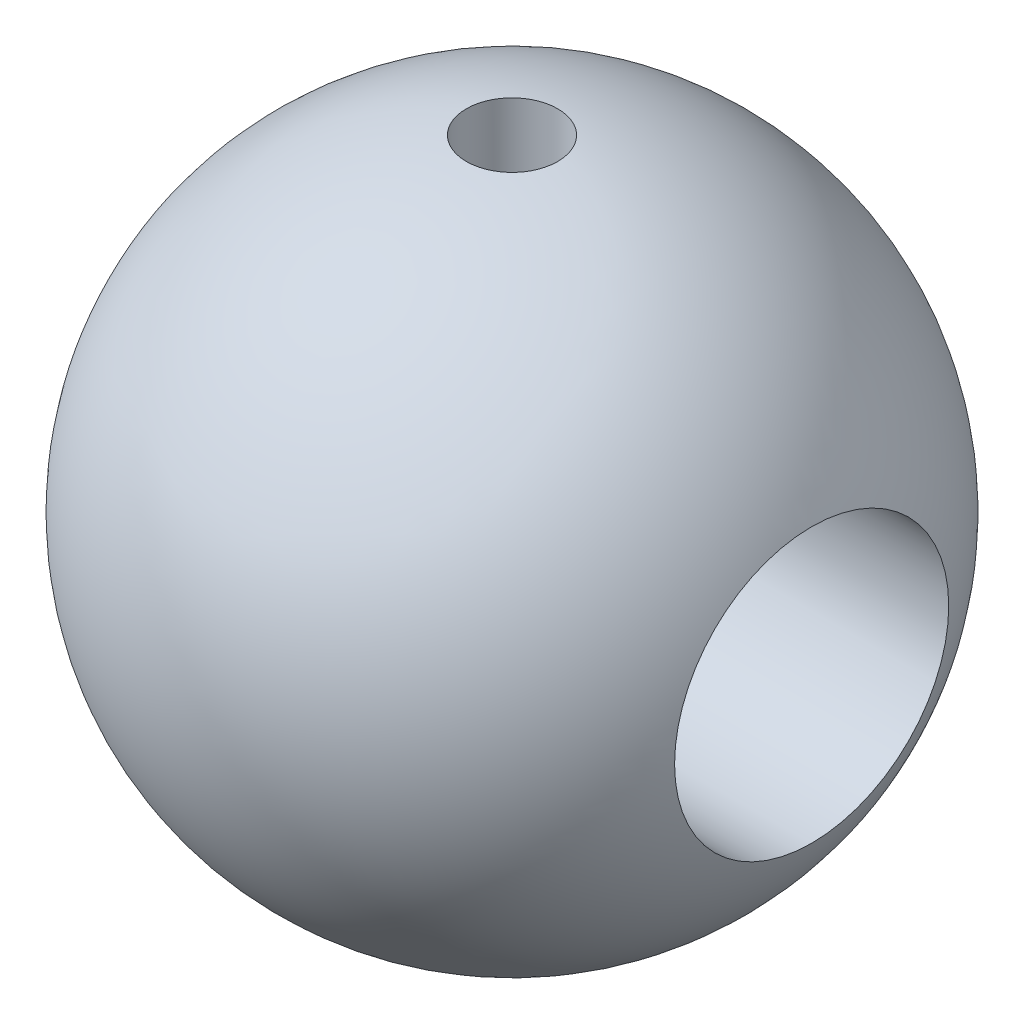
ISO-10303-21;
HEADER;
FILE_DESCRIPTION(('STEP AP214'),'2;1');
FILE_NAME('part.step','',(''),(''),'','','');
FILE_SCHEMA(('AUTOMOTIVE_DESIGN { 1 0 10303 214 1 1 1 1 }'));
ENDSEC;
DATA;
#1=APPLICATION_CONTEXT('core data for automotive mechanical design processes');
#2=APPLICATION_PROTOCOL_DEFINITION('international standard','automotive_design',2000,#1);
#3=PRODUCT_CONTEXT('',#1,'mechanical');
#4=PRODUCT('Part','Part','',(#3));
#5=PRODUCT_RELATED_PRODUCT_CATEGORY('part','',(#4));
#6=PRODUCT_DEFINITION_FORMATION('','',#4);
#7=PRODUCT_DEFINITION_CONTEXT('part definition',#1,'design');
#8=PRODUCT_DEFINITION('design','',#6,#7);
#9=PRODUCT_DEFINITION_SHAPE('','',#8);
#10=(LENGTH_UNIT() NAMED_UNIT(*) SI_UNIT(.MILLI.,.METRE.));
#11=(NAMED_UNIT(*) PLANE_ANGLE_UNIT() SI_UNIT($,.RADIAN.));
#12=(NAMED_UNIT(*) SI_UNIT($,.STERADIAN.) SOLID_ANGLE_UNIT());
#13=UNCERTAINTY_MEASURE_WITH_UNIT(LENGTH_MEASURE(1.E-05),#10,'distance_accuracy_value','');
#14=(GEOMETRIC_REPRESENTATION_CONTEXT(3) GLOBAL_UNCERTAINTY_ASSIGNED_CONTEXT((#13)) GLOBAL_UNIT_ASSIGNED_CONTEXT((#10,
#11,#12)) REPRESENTATION_CONTEXT('',''));
#15=CARTESIAN_POINT('',(0.,0.,0.));
#16=DIRECTION('',(0.,0.,1.));
#17=DIRECTION('',(1.,0.,0.));
#18=AXIS2_PLACEMENT_3D('',#15,#16,#17);
#19=CARTESIAN_POINT('',(0.,0.,0.));
#20=DIRECTION('',(-1.,0.,0.));
#21=DIRECTION('',(0.,1.,0.));
#22=AXIS2_PLACEMENT_3D('',#19,#20,#21);
#23=SPHERICAL_SURFACE('',#22,9.525);
#24=CARTESIAN_POINT('',(0.,9.43298003602255,0.));
#25=DIRECTION('',(0.,-1.,0.));
#26=DIRECTION('',(0.,0.,-1.));
#27=AXIS2_PLACEMENT_3D('',#24,#25,#26);
#28=CIRCLE('',#27,1.32079999999999);
#29=CARTESIAN_POINT('',(0.,9.43298003602255,-1.32079999999999));
#30=VERTEX_POINT('',#29);
#31=EDGE_CURVE('E56',#30,#30,#28,.T.);
#32=ORIENTED_EDGE('',*,*,#31,.T.);
#33=EDGE_LOOP('',(#32));
#34=FACE_BOUND('',#33,.T.);
#35=CARTESIAN_POINT('',(0.,-9.43298003602255,0.));
#36=DIRECTION('',(0.,1.,0.));
#37=DIRECTION('',(0.,0.,1.));
#38=AXIS2_PLACEMENT_3D('',#35,#36,#37);
#39=CIRCLE('',#38,1.32079999999999);
#40=CARTESIAN_POINT('',(0.,-9.43298003602255,1.32079999999999));
#41=VERTEX_POINT('',#40);
#42=EDGE_CURVE('E88',#41,#41,#39,.T.);
#43=ORIENTED_EDGE('',*,*,#42,.T.);
#44=EDGE_LOOP('',(#43));
#45=FACE_BOUND('',#44,.T.);
#46=CARTESIAN_POINT('',(8.66169794208965,0.,0.));
#47=DIRECTION('',(-1.,0.,0.));
#48=DIRECTION('',(0.,0.,1.));
#49=AXIS2_PLACEMENT_3D('',#46,#47,#48);
#50=CIRCLE('',#49,3.9624);
#51=CARTESIAN_POINT('',(8.66169794208965,0.,3.9624));
#52=VERTEX_POINT('',#51);
#53=EDGE_CURVE('E10',#52,#52,#50,.T.);
#54=ORIENTED_EDGE('',*,*,#53,.T.);
#55=EDGE_LOOP('',(#54));
#56=FACE_BOUND('',#55,.T.);
#57=CARTESIAN_POINT('',(-8.66169794208965,0.,0.));
#58=DIRECTION('',(1.,0.,0.));
#59=DIRECTION('',(0.,0.,-1.));
#60=AXIS2_PLACEMENT_3D('',#57,#58,#59);
#61=CIRCLE('',#60,3.9624);
#62=CARTESIAN_POINT('',(-8.66169794208965,0.,-3.9624));
#63=VERTEX_POINT('',#62);
#64=EDGE_CURVE('E51',#63,#63,#61,.F.);
#65=ORIENTED_EDGE('',*,*,#64,.F.);
#66=EDGE_LOOP('',(#65));
#67=FACE_BOUND('',#66,.T.);
#68=ADVANCED_FACE('F40',(#34,#45,#56,#67),#23,.T.);
#69=CARTESIAN_POINT('',(9.526,0.,0.));
#70=DIRECTION('',(-1.,0.,0.));
#71=DIRECTION('',(0.,0.,1.));
#72=AXIS2_PLACEMENT_3D('',#69,#70,#71);
#73=CYLINDRICAL_SURFACE('',#72,3.9624);
#74=CARTESIAN_POINT('',(0.,-3.73578654636477,1.32079999999999));
#75=CARTESIAN_POINT('',(0.0719415653234834,-3.73578630935797,1.32080034069733));
#76=CARTESIAN_POINT('',(0.143881083607,-3.73788736879365,1.31490234229183));
#77=CARTESIAN_POINT('',(0.285628839249202,-3.74602091846522,1.29154577473457));
#78=CARTESIAN_POINT('',(0.355436723551555,-3.75205405630203,1.27408530127201));
#79=CARTESIAN_POINT('',(0.490844800270815,-3.76729411432156,1.22828520549261));
#80=CARTESIAN_POINT('',(0.556452946807936,-3.77649481085322,1.1999669044294));
#81=CARTESIAN_POINT('',(0.682008352122144,-3.79702424351237,1.13332779884537));
#82=CARTESIAN_POINT('',(0.741954357916832,-3.80835344901011,1.09500478739852));
#83=CARTESIAN_POINT('',(0.856829326256439,-3.83236049609391,1.00783795422175));
#84=CARTESIAN_POINT('',(0.911504458189613,-3.84507194710806,0.958668790091949));
#85=CARTESIAN_POINT('',(1.0120059430575,-3.87012712629165,0.851899710856767));
#86=CARTESIAN_POINT('',(1.05783087499399,-3.88247079514093,0.794298444489172));
#87=CARTESIAN_POINT('',(1.14048292759292,-3.90578875430312,0.67044403412018));
#88=CARTESIAN_POINT('',(1.17704408919219,-3.91671891292281,0.604004364345348));
#89=CARTESIAN_POINT('',(1.23837096563641,-3.93558230207114,0.465491159321852));
#90=CARTESIAN_POINT('',(1.26313985942005,-3.94351634016925,0.393419148535667));
#91=CARTESIAN_POINT('',(1.29931831679846,-3.95525546830463,0.248348462066157));
#92=CARTESIAN_POINT('',(1.31116271181624,-3.95919461358202,0.175469277009798));
#93=CARTESIAN_POINT('',(1.32253856027075,-3.9629759773466,0.0286585530676581));
#94=CARTESIAN_POINT('',(1.3220731873425,-3.96281925180826,-0.0452727096647743));
#95=CARTESIAN_POINT('',(1.30911850856917,-3.95851737128427,-0.189011122867993));
#96=CARTESIAN_POINT('',(1.29710150839086,-3.95452888728583,-0.258866297779873));
#97=CARTESIAN_POINT('',(1.26216575072101,-3.94320834462294,-0.395504893996308));
#98=CARTESIAN_POINT('',(1.23924625437153,-3.93587605935177,-0.462288106778733));
#99=CARTESIAN_POINT('',(1.18288032410206,-3.9184922532338,-0.591919788771329));
#100=CARTESIAN_POINT('',(1.14929948436741,-3.90840625766055,-0.65470500225585));
#101=CARTESIAN_POINT('',(1.07267490104376,-3.88656485525469,-0.773888849156282));
#102=CARTESIAN_POINT('',(1.02962852613417,-3.87480898453644,-0.830285700055399));
#103=CARTESIAN_POINT('',(0.932914861117052,-3.85021378196656,-0.937901224541753));
#104=CARTESIAN_POINT('',(0.878842941117734,-3.83734949800058,-0.988751087454822));
#105=CARTESIAN_POINT('',(0.762829723065508,-3.81245400391743,-1.08078060447424));
#106=CARTESIAN_POINT('',(0.70088721450195,-3.80042292238899,-1.12195876827498));
#107=CARTESIAN_POINT('',(0.569722291287155,-3.7784194959901,-1.19398663062043));
#108=CARTESIAN_POINT('',(0.500408680889389,-3.76847894654715,-1.2246807131903));
#109=CARTESIAN_POINT('',(0.357182102453117,-3.75215044480057,-1.27383656970998));
#110=CARTESIAN_POINT('',(0.283271076242212,-3.74576100378016,-1.2923034702339));
#111=CARTESIAN_POINT('',(0.13652006018686,-3.73759503627775,-1.31572982138509));
#112=CARTESIAN_POINT('',(0.0637821917958457,-3.73562339904236,-1.32126108534398));
#113=CARTESIAN_POINT('',(-0.0815939377537843,-3.73597092460547,-1.32027886371444));
#114=CARTESIAN_POINT('',(-0.154232214605505,-3.73828930807088,-1.31376756580016));
#115=CARTESIAN_POINT('',(-0.294745720311303,-3.74676114772452,-1.28939884056965));
#116=CARTESIAN_POINT('',(-0.362698852142965,-3.75278013041936,-1.27193884516951));
#117=CARTESIAN_POINT('',(-0.494697195120977,-3.76782705689014,-1.22664526967003));
#118=CARTESIAN_POINT('',(-0.558741711133172,-3.77685553406025,-1.19880985055685));
#119=CARTESIAN_POINT('',(-0.683356059854637,-3.79725875928424,-1.13255210924793));
#120=CARTESIAN_POINT('',(-0.743751253601268,-3.80869884299137,-1.09382199712788));
#121=CARTESIAN_POINT('',(-0.857392105988432,-3.83250947339884,-1.00722310084043));
#122=CARTESIAN_POINT('',(-0.910635649143739,-3.8448802937337,-0.959351622718788));
#123=CARTESIAN_POINT('',(-1.0111093613869,-3.86987847032864,-0.85309376515314));
#124=CARTESIAN_POINT('',(-1.05792697433689,-3.88248953397684,-0.794312306938011));
#125=CARTESIAN_POINT('',(-1.14106044081329,-3.90596025610596,-0.669417486481454));
#126=CARTESIAN_POINT('',(-1.17737666735132,-3.91681997678892,-0.603304384777096));
#127=CARTESIAN_POINT('',(-1.23814447450135,-3.93551387194644,-0.465951642300572));
#128=CARTESIAN_POINT('',(-1.26267327885716,-3.94336766829984,-0.394748979682633));
#129=CARTESIAN_POINT('',(-1.29930760171298,-3.95524933194533,-0.248915941689416));
#130=CARTESIAN_POINT('',(-1.31141760458616,-3.95927858022532,-0.174286813772695));
#131=CARTESIAN_POINT('',(-1.32246695210152,-3.96295292962447,-0.0274928956039407));
#132=CARTESIAN_POINT('',(-1.32199856515388,-3.96279518454131,0.0446228633535615));
#133=CARTESIAN_POINT('',(-1.30936542740021,-3.95859869162821,0.18770040031623));
#134=CARTESIAN_POINT('',(-1.29720162545581,-3.95456025864267,0.25866227146261));
#135=CARTESIAN_POINT('',(-1.26191578457206,-3.94312840471788,0.396295631345862));
#136=CARTESIAN_POINT('',(-1.23897087236184,-3.93578929243405,0.46301736422161));
#137=CARTESIAN_POINT('',(-1.18293815692687,-3.91851193858497,0.59168980592128));
#138=CARTESIAN_POINT('',(-1.14984851893578,-3.9085732269062,0.653639649167322));
#139=CARTESIAN_POINT('',(-1.07305818841566,-3.88666359547865,0.77350540874064));
#140=CARTESIAN_POINT('',(-1.02901060034792,-3.87463115587337,0.831187697057284));
#141=CARTESIAN_POINT('',(-0.932144837760891,-3.85003939596315,0.938535419500617));
#142=CARTESIAN_POINT('',(-0.879323864979382,-3.83747990851507,0.988198285841756));
#143=CARTESIAN_POINT('',(-0.763938363140752,-3.8126645999365,1.08007338110678));
#144=CARTESIAN_POINT('',(-0.701073361102048,-3.80043991127383,1.12191785349002));
#145=CARTESIAN_POINT('',(-0.568823088946803,-3.77828303341039,1.19441838463211));
#146=CARTESIAN_POINT('',(-0.499439528486414,-3.76835024544978,1.22507736682316));
#147=CARTESIAN_POINT('',(-0.359308022840149,-3.75241042219965,1.27304492829205));
#148=CARTESIAN_POINT('',(-0.288763514335693,-3.74624623077767,1.29089432640468));
#149=CARTESIAN_POINT('',(-0.145478128543579,-3.73793510578996,1.31476965005314));
#150=CARTESIAN_POINT('',(-0.0727380179639347,-3.73578678599543,1.32079965553085));
#151=CARTESIAN_POINT('',(0.,-3.73578654636477,1.32079999999999));
#152=B_SPLINE_CURVE_WITH_KNOTS('',3,(#74,#75,#76,#77,#78,#79,#80,#81,#82,#83,#84,#85,#86,#87,
#88,#89,#90,#91,#92,#93,#94,#95,#96,#97,#98,#99,#100,#101,#102,#103,#104,#105,#106,#107,#108,
#109,#110,#111,#112,#113,#114,#115,#116,#117,#118,#119,#120,#121,#122,#123,#124,#125,#126,#127,
#128,#129,#130,#131,#132,#133,#134,#135,#136,#137,#138,#139,#140,#141,#142,#143,#144,#145,#146,
#147,#148,#149,#150,#151),.UNSPECIFIED.,.T.,.F.,(4,2,2,2,2,2,2,2,2,2,2,2,2,2,2,2,2,2,2,2,2,2,2,
2,2,2,2,2,2,2,2,2,2,2,2,2,2,2,4),(0.,0.215555332402988,0.431146175064026,0.64631581760309,
0.861532964297727,1.08439446474331,1.30729171839161,1.53600462914541,1.7646558489167,
1.98535152224724,2.20599029761713,2.4179754157361,2.62997490205142,2.84476089739529,
3.05960667667206,3.2845677429986,3.50956345071667,3.73776678703317,3.96587438228779,
4.18369068031113,4.40146741330779,4.6117633392836,4.82209655734247,5.03910107294293,
5.25616963859498,5.4836816982934,5.71118567571909,5.93717815401837,6.1630889986885,
6.37838206239181,6.59365766061079,6.80551387535159,7.0174084288505,7.23713234179812,
7.45692647051579,7.68532446730859,7.91366272731836,8.13167970621441,8.34962141446123),.UNSPECIFIED.);
#153=CARTESIAN_POINT('',(0.,-3.73578654636477,1.32079999999999));
#154=VERTEX_POINT('',#153);
#155=EDGE_CURVE('E43',#154,#154,#152,.T.);
#156=ORIENTED_EDGE('',*,*,#155,.F.);
#157=EDGE_LOOP('',(#156));
#158=FACE_BOUND('',#157,.T.);
#159=CARTESIAN_POINT('',(0.,3.73578654636477,1.32079999999999));
#160=CARTESIAN_POINT('',(-0.0719415653234834,3.73578630935797,1.32080034069733));
#161=CARTESIAN_POINT('',(-0.143881083607,3.73788736879365,1.31490234229183));
#162=CARTESIAN_POINT('',(-0.285628839249202,3.74602091846522,1.29154577473457));
#163=CARTESIAN_POINT('',(-0.355436723551555,3.75205405630203,1.27408530127201));
#164=CARTESIAN_POINT('',(-0.490844800270815,3.76729411432156,1.22828520549261));
#165=CARTESIAN_POINT('',(-0.556452946807936,3.77649481085322,1.1999669044294));
#166=CARTESIAN_POINT('',(-0.682008352122144,3.79702424351237,1.13332779884537));
#167=CARTESIAN_POINT('',(-0.741954357916832,3.80835344901011,1.09500478739852));
#168=CARTESIAN_POINT('',(-0.856829326256439,3.83236049609391,1.00783795422175));
#169=CARTESIAN_POINT('',(-0.911504458189613,3.84507194710806,0.958668790091949));
#170=CARTESIAN_POINT('',(-1.0120059430575,3.87012712629165,0.851899710856767));
#171=CARTESIAN_POINT('',(-1.05783087499399,3.88247079514093,0.794298444489172));
#172=CARTESIAN_POINT('',(-1.14048292759292,3.90578875430312,0.67044403412018));
#173=CARTESIAN_POINT('',(-1.17704408919219,3.91671891292281,0.604004364345348));
#174=CARTESIAN_POINT('',(-1.23837096563641,3.93558230207114,0.465491159321852));
#175=CARTESIAN_POINT('',(-1.26313985942005,3.94351634016925,0.393419148535667));
#176=CARTESIAN_POINT('',(-1.29931831679846,3.95525546830463,0.248348462066157));
#177=CARTESIAN_POINT('',(-1.31116271181624,3.95919461358202,0.175469277009798));
#178=CARTESIAN_POINT('',(-1.32253856027075,3.9629759773466,0.0286585530676581));
#179=CARTESIAN_POINT('',(-1.3220731873425,3.96281925180826,-0.0452727096647743));
#180=CARTESIAN_POINT('',(-1.30911850856917,3.95851737128427,-0.189011122867993));
#181=CARTESIAN_POINT('',(-1.29710150839086,3.95452888728583,-0.258866297779873));
#182=CARTESIAN_POINT('',(-1.26216575072101,3.94320834462294,-0.395504893996308));
#183=CARTESIAN_POINT('',(-1.23924625437153,3.93587605935177,-0.462288106778733));
#184=CARTESIAN_POINT('',(-1.18288032410206,3.9184922532338,-0.591919788771329));
#185=CARTESIAN_POINT('',(-1.14929948436741,3.90840625766055,-0.65470500225585));
#186=CARTESIAN_POINT('',(-1.07267490104376,3.88656485525469,-0.773888849156282));
#187=CARTESIAN_POINT('',(-1.02962852613417,3.87480898453644,-0.830285700055399));
#188=CARTESIAN_POINT('',(-0.932914861117052,3.85021378196656,-0.937901224541753));
#189=CARTESIAN_POINT('',(-0.878842941117734,3.83734949800058,-0.988751087454822));
#190=CARTESIAN_POINT('',(-0.762829723065508,3.81245400391743,-1.08078060447424));
#191=CARTESIAN_POINT('',(-0.70088721450195,3.80042292238899,-1.12195876827498));
#192=CARTESIAN_POINT('',(-0.569722291287155,3.7784194959901,-1.19398663062043));
#193=CARTESIAN_POINT('',(-0.500408680889389,3.76847894654715,-1.2246807131903));
#194=CARTESIAN_POINT('',(-0.357182102453117,3.75215044480057,-1.27383656970998));
#195=CARTESIAN_POINT('',(-0.283271076242212,3.74576100378016,-1.2923034702339));
#196=CARTESIAN_POINT('',(-0.13652006018686,3.73759503627775,-1.31572982138509));
#197=CARTESIAN_POINT('',(-0.0637821917958457,3.73562339904236,-1.32126108534398));
#198=CARTESIAN_POINT('',(0.0815939377537843,3.73597092460547,-1.32027886371444));
#199=CARTESIAN_POINT('',(0.154232214605505,3.73828930807088,-1.31376756580016));
#200=CARTESIAN_POINT('',(0.294745720311303,3.74676114772452,-1.28939884056965));
#201=CARTESIAN_POINT('',(0.362698852142965,3.75278013041936,-1.27193884516951));
#202=CARTESIAN_POINT('',(0.494697195120977,3.76782705689014,-1.22664526967003));
#203=CARTESIAN_POINT('',(0.558741711133172,3.77685553406025,-1.19880985055685));
#204=CARTESIAN_POINT('',(0.683356059854637,3.79725875928424,-1.13255210924793));
#205=CARTESIAN_POINT('',(0.743751253601268,3.80869884299137,-1.09382199712788));
#206=CARTESIAN_POINT('',(0.857392105988432,3.83250947339884,-1.00722310084043));
#207=CARTESIAN_POINT('',(0.910635649143739,3.8448802937337,-0.959351622718788));
#208=CARTESIAN_POINT('',(1.0111093613869,3.86987847032864,-0.85309376515314));
#209=CARTESIAN_POINT('',(1.05792697433689,3.88248953397684,-0.794312306938011));
#210=CARTESIAN_POINT('',(1.14106044081329,3.90596025610596,-0.669417486481454));
#211=CARTESIAN_POINT('',(1.17737666735132,3.91681997678892,-0.603304384777096));
#212=CARTESIAN_POINT('',(1.23814447450135,3.93551387194644,-0.465951642300572));
#213=CARTESIAN_POINT('',(1.26267327885716,3.94336766829984,-0.394748979682633));
#214=CARTESIAN_POINT('',(1.29930760171298,3.95524933194533,-0.248915941689416));
#215=CARTESIAN_POINT('',(1.31141760458616,3.95927858022532,-0.174286813772695));
#216=CARTESIAN_POINT('',(1.32246695210152,3.96295292962447,-0.0274928956039407));
#217=CARTESIAN_POINT('',(1.32199856515388,3.96279518454131,0.0446228633535615));
#218=CARTESIAN_POINT('',(1.30936542740021,3.95859869162821,0.18770040031623));
#219=CARTESIAN_POINT('',(1.29720162545581,3.95456025864267,0.25866227146261));
#220=CARTESIAN_POINT('',(1.26191578457206,3.94312840471788,0.396295631345862));
#221=CARTESIAN_POINT('',(1.23897087236184,3.93578929243405,0.46301736422161));
#222=CARTESIAN_POINT('',(1.18293815692687,3.91851193858497,0.59168980592128));
#223=CARTESIAN_POINT('',(1.14984851893578,3.9085732269062,0.653639649167322));
#224=CARTESIAN_POINT('',(1.07305818841566,3.88666359547865,0.77350540874064));
#225=CARTESIAN_POINT('',(1.02901060034792,3.87463115587337,0.831187697057284));
#226=CARTESIAN_POINT('',(0.932144837760891,3.85003939596315,0.938535419500617));
#227=CARTESIAN_POINT('',(0.879323864979382,3.83747990851507,0.988198285841756));
#228=CARTESIAN_POINT('',(0.763938363140752,3.8126645999365,1.08007338110678));
#229=CARTESIAN_POINT('',(0.701073361102048,3.80043991127383,1.12191785349002));
#230=CARTESIAN_POINT('',(0.568823088946803,3.77828303341039,1.19441838463211));
#231=CARTESIAN_POINT('',(0.499439528486414,3.76835024544978,1.22507736682316));
#232=CARTESIAN_POINT('',(0.359308022840149,3.75241042219965,1.27304492829205));
#233=CARTESIAN_POINT('',(0.288763514335693,3.74624623077767,1.29089432640468));
#234=CARTESIAN_POINT('',(0.145478128543579,3.73793510578996,1.31476965005314));
#235=CARTESIAN_POINT('',(0.0727380179639347,3.73578678599543,1.32079965553085));
#236=CARTESIAN_POINT('',(0.,3.73578654636477,1.32079999999999));
#237=B_SPLINE_CURVE_WITH_KNOTS('',3,(#159,#160,#161,#162,#163,#164,#165,#166,#167,#168,#169,
#170,#171,#172,#173,#174,#175,#176,#177,#178,#179,#180,#181,#182,#183,#184,#185,#186,#187,#188,
#189,#190,#191,#192,#193,#194,#195,#196,#197,#198,#199,#200,#201,#202,#203,#204,#205,#206,#207,
#208,#209,#210,#211,#212,#213,#214,#215,#216,#217,#218,#219,#220,#221,#222,#223,#224,#225,#226,
#227,#228,#229,#230,#231,#232,#233,#234,#235,#236),.UNSPECIFIED.,.T.,.F.,(4,2,2,2,2,2,2,2,2,2,2,
2,2,2,2,2,2,2,2,2,2,2,2,2,2,2,2,2,2,2,2,2,2,2,2,2,2,2,4),(0.,0.215555332402988,
0.431146175064026,0.64631581760309,0.861532964297727,1.08439446474331,1.30729171839161,
1.53600462914541,1.7646558489167,1.98535152224724,2.20599029761713,2.4179754157361,
2.62997490205142,2.84476089739529,3.05960667667206,3.2845677429986,3.50956345071667,
3.73776678703317,3.96587438228779,4.18369068031113,4.40146741330779,4.6117633392836,
4.82209655734247,5.03910107294293,5.25616963859498,5.4836816982934,5.71118567571909,
5.93717815401837,6.1630889986885,6.37838206239181,6.59365766061079,6.80551387535159,
7.0174084288505,7.23713234179812,7.45692647051579,7.68532446730859,7.91366272731836,
8.13167970621441,8.34962141446123),.UNSPECIFIED.);
#238=CARTESIAN_POINT('',(0.,3.73578654636477,1.32079999999999));
#239=VERTEX_POINT('',#238);
#240=EDGE_CURVE('E59',#239,#239,#237,.T.);
#241=ORIENTED_EDGE('',*,*,#240,.F.);
#242=EDGE_LOOP('',(#241));
#243=FACE_BOUND('',#242,.T.);
#244=ORIENTED_EDGE('',*,*,#53,.F.);
#245=EDGE_LOOP('',(#244));
#246=FACE_BOUND('',#245,.T.);
#247=ORIENTED_EDGE('',*,*,#64,.T.);
#248=EDGE_LOOP('',(#247));
#249=FACE_BOUND('',#248,.T.);
#250=ADVANCED_FACE('F64',(#158,#243,#246,#249),#73,.F.);
#251=CARTESIAN_POINT('',(0.,9.525,0.));
#252=DIRECTION('',(0.,1.,0.));
#253=DIRECTION('',(0.,0.,1.));
#254=AXIS2_PLACEMENT_3D('',#251,#252,#253);
#255=CYLINDRICAL_SURFACE('',#254,1.32079999999999);
#256=ORIENTED_EDGE('',*,*,#240,.T.);
#257=EDGE_LOOP('',(#256));
#258=FACE_BOUND('',#257,.T.);
#259=ORIENTED_EDGE('',*,*,#31,.F.);
#260=EDGE_LOOP('',(#259));
#261=FACE_BOUND('',#260,.T.);
#262=ADVANCED_FACE('F66',(#258,#261),#255,.F.);
#263=ORIENTED_EDGE('',*,*,#155,.T.);
#264=EDGE_LOOP('',(#263));
#265=FACE_BOUND('',#264,.T.);
#266=ORIENTED_EDGE('',*,*,#42,.F.);
#267=EDGE_LOOP('',(#266));
#268=FACE_BOUND('',#267,.T.);
#269=ADVANCED_FACE('F69',(#265,#268),#255,.F.);
#270=CLOSED_SHELL('',(#68,#250,#262,#269));
#271=MANIFOLD_SOLID_BREP('B2',#270);
#272=ADVANCED_BREP_SHAPE_REPRESENTATION('',(#18,#271),#14);
#273=SHAPE_DEFINITION_REPRESENTATION(#9,#272);
ENDSEC;
END-ISO-10303-21;
